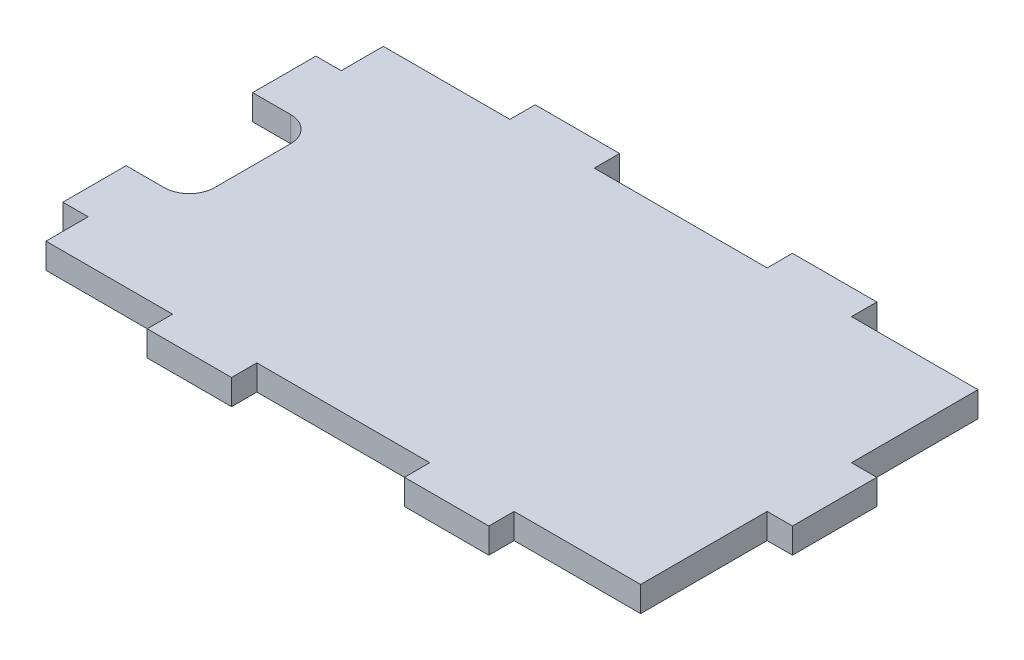
ISO-10303-21;
HEADER;
FILE_DESCRIPTION(('STEP AP214'),'2;1');
FILE_NAME('part.step','',(''),(''),'','','');
FILE_SCHEMA(('AUTOMOTIVE_DESIGN { 1 0 10303 214 1 1 1 1 }'));
ENDSEC;
DATA;
#1=APPLICATION_CONTEXT('core data for automotive mechanical design processes');
#2=APPLICATION_PROTOCOL_DEFINITION('international standard','automotive_design',2000,#1);
#3=PRODUCT_CONTEXT('',#1,'mechanical');
#4=PRODUCT('Part','Part','',(#3));
#5=PRODUCT_RELATED_PRODUCT_CATEGORY('part','',(#4));
#6=PRODUCT_DEFINITION_FORMATION('','',#4);
#7=PRODUCT_DEFINITION_CONTEXT('part definition',#1,'design');
#8=PRODUCT_DEFINITION('design','',#6,#7);
#9=PRODUCT_DEFINITION_SHAPE('','',#8);
#10=(LENGTH_UNIT() NAMED_UNIT(*) SI_UNIT(.MILLI.,.METRE.));
#11=(NAMED_UNIT(*) PLANE_ANGLE_UNIT() SI_UNIT($,.RADIAN.));
#12=(NAMED_UNIT(*) SI_UNIT($,.STERADIAN.) SOLID_ANGLE_UNIT());
#13=UNCERTAINTY_MEASURE_WITH_UNIT(LENGTH_MEASURE(1.E-05),#10,'distance_accuracy_value','');
#14=(GEOMETRIC_REPRESENTATION_CONTEXT(3) GLOBAL_UNCERTAINTY_ASSIGNED_CONTEXT((#13)) GLOBAL_UNIT_ASSIGNED_CONTEXT((#10,
#11,#12)) REPRESENTATION_CONTEXT('',''));
#15=CARTESIAN_POINT('',(0.,0.,0.));
#16=DIRECTION('',(0.,0.,1.));
#17=DIRECTION('',(1.,0.,0.));
#18=AXIS2_PLACEMENT_3D('',#15,#16,#17);
#19=CARTESIAN_POINT('',(141.,6.,0.));
#20=DIRECTION('',(-1.,0.,0.));
#21=DIRECTION('',(0.,0.,1.));
#22=AXIS2_PLACEMENT_3D('',#19,#20,#21);
#23=PLANE('',#22);
#24=DIRECTION('',(0.,-1.,0.));
#25=VECTOR('',#24,1.);
#26=CARTESIAN_POINT('',(141.,6.,50.));
#27=LINE('',#26,#25);
#28=CARTESIAN_POINT('',(141.,6.,50.));
#29=VERTEX_POINT('',#28);
#30=CARTESIAN_POINT('',(141.,0.,50.));
#31=VERTEX_POINT('',#30);
#32=EDGE_CURVE('E47',#29,#31,#27,.T.);
#33=ORIENTED_EDGE('',*,*,#32,.F.);
#34=DIRECTION('',(0.,0.,-1.));
#35=VECTOR('',#34,1.);
#36=CARTESIAN_POINT('',(141.,6.,0.));
#37=LINE('',#36,#35);
#38=CARTESIAN_POINT('',(141.,6.,80.));
#39=VERTEX_POINT('',#38);
#40=EDGE_CURVE('E480',#39,#29,#37,.T.);
#41=ORIENTED_EDGE('',*,*,#40,.F.);
#42=DIRECTION('',(0.,-1.,0.));
#43=VECTOR('',#42,1.);
#44=CARTESIAN_POINT('',(141.,6.,80.));
#45=LINE('',#44,#43);
#46=CARTESIAN_POINT('',(141.,0.,80.));
#47=VERTEX_POINT('',#46);
#48=EDGE_CURVE('E40',#39,#47,#45,.T.);
#49=ORIENTED_EDGE('',*,*,#48,.T.);
#50=DIRECTION('',(0.,0.,-1.));
#51=VECTOR('',#50,1.);
#52=CARTESIAN_POINT('',(141.,0.,0.));
#53=LINE('',#52,#51);
#54=EDGE_CURVE('E495',#47,#31,#53,.T.);
#55=ORIENTED_EDGE('',*,*,#54,.T.);
#56=EDGE_LOOP('',(#33,#41,#49,#55));
#57=FACE_BOUND('',#56,.T.);
#58=ADVANCED_FACE('F32',(#57),#23,.F.);
#59=DIRECTION('',(0.,1.,0.));
#60=VECTOR('',#59,1.);
#61=CARTESIAN_POINT('',(141.,6.,30.));
#62=LINE('',#61,#60);
#63=CARTESIAN_POINT('',(141.,0.,30.));
#64=VERTEX_POINT('',#63);
#65=CARTESIAN_POINT('',(141.,6.,30.));
#66=VERTEX_POINT('',#65);
#67=EDGE_CURVE('E55',#64,#66,#62,.T.);
#68=ORIENTED_EDGE('',*,*,#67,.F.);
#69=CARTESIAN_POINT('',(141.,0.,0.));
#70=VERTEX_POINT('',#69);
#71=EDGE_CURVE('E493',#64,#70,#53,.T.);
#72=ORIENTED_EDGE('',*,*,#71,.T.);
#73=DIRECTION('',(0.,-1.,0.));
#74=VECTOR('',#73,1.);
#75=CARTESIAN_POINT('',(141.,6.,0.));
#76=LINE('',#75,#74);
#77=CARTESIAN_POINT('',(141.,6.,0.));
#78=VERTEX_POINT('',#77);
#79=EDGE_CURVE('E503',#78,#70,#76,.T.);
#80=ORIENTED_EDGE('',*,*,#79,.F.);
#81=EDGE_CURVE('E478',#66,#78,#37,.T.);
#82=ORIENTED_EDGE('',*,*,#81,.F.);
#83=EDGE_LOOP('',(#68,#72,#80,#82));
#84=FACE_BOUND('',#83,.T.);
#85=ADVANCED_FACE('F627',(#84),#23,.F.);
#86=CARTESIAN_POINT('',(0.,6.,0.));
#87=DIRECTION('',(1.,0.,0.));
#88=DIRECTION('',(0.,0.,-1.));
#89=AXIS2_PLACEMENT_3D('',#86,#87,#88);
#90=PLANE('',#89);
#91=DIRECTION('',(0.,1.,0.));
#92=VECTOR('',#91,1.);
#93=CARTESIAN_POINT('',(0.,0.,70.));
#94=LINE('',#93,#92);
#95=CARTESIAN_POINT('',(0.,0.,70.));
#96=VERTEX_POINT('',#95);
#97=CARTESIAN_POINT('',(0.,6.,70.));
#98=VERTEX_POINT('',#97);
#99=EDGE_CURVE('E324',#96,#98,#94,.T.);
#100=ORIENTED_EDGE('',*,*,#99,.F.);
#101=DIRECTION('',(0.,0.,1.));
#102=VECTOR('',#101,1.);
#103=CARTESIAN_POINT('',(0.,0.,0.));
#104=LINE('',#103,#102);
#105=CARTESIAN_POINT('',(0.,0.,80.));
#106=VERTEX_POINT('',#105);
#107=EDGE_CURVE('E469',#96,#106,#104,.T.);
#108=ORIENTED_EDGE('',*,*,#107,.T.);
#109=DIRECTION('',(0.,-1.,0.));
#110=VECTOR('',#109,1.);
#111=CARTESIAN_POINT('',(0.,6.,80.));
#112=LINE('',#111,#110);
#113=CARTESIAN_POINT('',(0.,6.,80.));
#114=VERTEX_POINT('',#113);
#115=EDGE_CURVE('E11',#114,#106,#112,.T.);
#116=ORIENTED_EDGE('',*,*,#115,.F.);
#117=DIRECTION('',(0.,0.,1.));
#118=VECTOR('',#117,1.);
#119=CARTESIAN_POINT('',(0.,6.,0.));
#120=LINE('',#119,#118);
#121=EDGE_CURVE('E474',#98,#114,#120,.T.);
#122=ORIENTED_EDGE('',*,*,#121,.F.);
#123=EDGE_LOOP('',(#100,#108,#116,#122));
#124=FACE_BOUND('',#123,.T.);
#125=ADVANCED_FACE('F559',(#124),#90,.F.);
#126=DIRECTION('',(0.,-1.,0.));
#127=VECTOR('',#126,1.);
#128=CARTESIAN_POINT('',(0.,0.,10.));
#129=LINE('',#128,#127);
#130=CARTESIAN_POINT('',(0.,6.,10.));
#131=VERTEX_POINT('',#130);
#132=CARTESIAN_POINT('',(0.,0.,10.));
#133=VERTEX_POINT('',#132);
#134=EDGE_CURVE('E266',#131,#133,#129,.T.);
#135=ORIENTED_EDGE('',*,*,#134,.F.);
#136=CARTESIAN_POINT('',(0.,6.,0.));
#137=VERTEX_POINT('',#136);
#138=EDGE_CURVE('E470',#137,#131,#120,.T.);
#139=ORIENTED_EDGE('',*,*,#138,.F.);
#140=DIRECTION('',(0.,-1.,0.));
#141=VECTOR('',#140,1.);
#142=CARTESIAN_POINT('',(0.,6.,0.));
#143=LINE('',#142,#141);
#144=CARTESIAN_POINT('',(0.,0.,0.));
#145=VERTEX_POINT('',#144);
#146=EDGE_CURVE('E486',#137,#145,#143,.T.);
#147=ORIENTED_EDGE('',*,*,#146,.T.);
#148=EDGE_CURVE('E488',#145,#133,#104,.T.);
#149=ORIENTED_EDGE('',*,*,#148,.T.);
#150=EDGE_LOOP('',(#135,#139,#147,#149));
#151=FACE_BOUND('',#150,.T.);
#152=ADVANCED_FACE('F34',(#151),#90,.F.);
#153=CARTESIAN_POINT('',(0.,6.,0.));
#154=DIRECTION('',(0.,0.,1.));
#155=DIRECTION('',(1.,0.,0.));
#156=AXIS2_PLACEMENT_3D('',#153,#154,#155);
#157=PLANE('',#156);
#158=DIRECTION('',(0.,-1.,0.));
#159=VECTOR('',#158,1.);
#160=CARTESIAN_POINT('',(50.,0.,0.));
#161=LINE('',#160,#159);
#162=CARTESIAN_POINT('',(50.,6.,0.));
#163=VERTEX_POINT('',#162);
#164=CARTESIAN_POINT('',(50.,0.,0.));
#165=VERTEX_POINT('',#164);
#166=EDGE_CURVE('E361',#163,#165,#161,.T.);
#167=ORIENTED_EDGE('',*,*,#166,.F.);
#168=DIRECTION('',(-1.,0.,0.));
#169=VECTOR('',#168,1.);
#170=CARTESIAN_POINT('',(0.,6.,0.));
#171=LINE('',#170,#169);
#172=CARTESIAN_POINT('',(91.,6.,0.));
#173=VERTEX_POINT('',#172);
#174=EDGE_CURVE('E487',#173,#163,#171,.T.);
#175=ORIENTED_EDGE('',*,*,#174,.F.);
#176=DIRECTION('',(0.,1.,0.));
#177=VECTOR('',#176,1.);
#178=CARTESIAN_POINT('',(91.,6.,0.));
#179=LINE('',#178,#177);
#180=CARTESIAN_POINT('',(91.,0.,0.));
#181=VERTEX_POINT('',#180);
#182=EDGE_CURVE('E393',#181,#173,#179,.T.);
#183=ORIENTED_EDGE('',*,*,#182,.F.);
#184=DIRECTION('',(-1.,0.,0.));
#185=VECTOR('',#184,1.);
#186=CARTESIAN_POINT('',(0.,0.,0.));
#187=LINE('',#186,#185);
#188=EDGE_CURVE('E500',#181,#165,#187,.T.);
#189=ORIENTED_EDGE('',*,*,#188,.T.);
#190=EDGE_LOOP('',(#167,#175,#183,#189));
#191=FACE_BOUND('',#190,.T.);
#192=ADVANCED_FACE('F598',(#191),#157,.F.);
#193=DIRECTION('',(0.,1.,0.));
#194=VECTOR('',#193,1.);
#195=CARTESIAN_POINT('',(30.,6.,0.));
#196=LINE('',#195,#194);
#197=CARTESIAN_POINT('',(30.,0.,0.));
#198=VERTEX_POINT('',#197);
#199=CARTESIAN_POINT('',(30.,6.,0.));
#200=VERTEX_POINT('',#199);
#201=EDGE_CURVE('E366',#198,#200,#196,.T.);
#202=ORIENTED_EDGE('',*,*,#201,.F.);
#203=EDGE_CURVE('E497',#198,#145,#187,.T.);
#204=ORIENTED_EDGE('',*,*,#203,.T.);
#205=ORIENTED_EDGE('',*,*,#146,.F.);
#206=EDGE_CURVE('E482',#200,#137,#171,.T.);
#207=ORIENTED_EDGE('',*,*,#206,.F.);
#208=EDGE_LOOP('',(#202,#204,#205,#207));
#209=FACE_BOUND('',#208,.T.);
#210=ADVANCED_FACE('F594',(#209),#157,.F.);
#211=DIRECTION('',(0.,-1.,0.));
#212=VECTOR('',#211,1.);
#213=CARTESIAN_POINT('',(111.,0.,0.));
#214=LINE('',#213,#212);
#215=CARTESIAN_POINT('',(111.,6.,0.));
#216=VERTEX_POINT('',#215);
#217=CARTESIAN_POINT('',(111.,0.,0.));
#218=VERTEX_POINT('',#217);
#219=EDGE_CURVE('E388',#216,#218,#214,.T.);
#220=ORIENTED_EDGE('',*,*,#219,.F.);
#221=EDGE_CURVE('E483',#78,#216,#171,.T.);
#222=ORIENTED_EDGE('',*,*,#221,.F.);
#223=ORIENTED_EDGE('',*,*,#79,.T.);
#224=EDGE_CURVE('E498',#70,#218,#187,.T.);
#225=ORIENTED_EDGE('',*,*,#224,.T.);
#226=EDGE_LOOP('',(#220,#222,#223,#225));
#227=FACE_BOUND('',#226,.T.);
#228=ADVANCED_FACE('F624',(#227),#157,.F.);
#229=CARTESIAN_POINT('',(0.,6.,80.));
#230=DIRECTION('',(0.,0.,-1.));
#231=DIRECTION('',(-1.,0.,0.));
#232=AXIS2_PLACEMENT_3D('',#229,#230,#231);
#233=PLANE('',#232);
#234=DIRECTION('',(0.,-1.,0.));
#235=VECTOR('',#234,1.);
#236=CARTESIAN_POINT('',(91.,0.,80.));
#237=LINE('',#236,#235);
#238=CARTESIAN_POINT('',(91.,6.,80.));
#239=VERTEX_POINT('',#238);
#240=CARTESIAN_POINT('',(91.,0.,80.));
#241=VERTEX_POINT('',#240);
#242=EDGE_CURVE('E415',#239,#241,#237,.T.);
#243=ORIENTED_EDGE('',*,*,#242,.F.);
#244=DIRECTION('',(1.,0.,0.));
#245=VECTOR('',#244,1.);
#246=CARTESIAN_POINT('',(0.,6.,80.));
#247=LINE('',#246,#245);
#248=CARTESIAN_POINT('',(50.,6.,80.));
#249=VERTEX_POINT('',#248);
#250=EDGE_CURVE('E479',#249,#239,#247,.T.);
#251=ORIENTED_EDGE('',*,*,#250,.F.);
#252=DIRECTION('',(0.,1.,0.));
#253=VECTOR('',#252,1.);
#254=CARTESIAN_POINT('',(50.,0.,80.));
#255=LINE('',#254,#253);
#256=CARTESIAN_POINT('',(50.,0.,80.));
#257=VERTEX_POINT('',#256);
#258=EDGE_CURVE('E447',#257,#249,#255,.T.);
#259=ORIENTED_EDGE('',*,*,#258,.F.);
#260=DIRECTION('',(1.,0.,0.));
#261=VECTOR('',#260,1.);
#262=CARTESIAN_POINT('',(0.,0.,80.));
#263=LINE('',#262,#261);
#264=EDGE_CURVE('E494',#257,#241,#263,.T.);
#265=ORIENTED_EDGE('',*,*,#264,.T.);
#266=EDGE_LOOP('',(#243,#251,#259,#265));
#267=FACE_BOUND('',#266,.T.);
#268=ADVANCED_FACE('F538',(#267),#233,.F.);
#269=DIRECTION('',(0.,1.,0.));
#270=VECTOR('',#269,1.);
#271=CARTESIAN_POINT('',(111.,0.,80.));
#272=LINE('',#271,#270);
#273=CARTESIAN_POINT('',(111.,0.,80.));
#274=VERTEX_POINT('',#273);
#275=CARTESIAN_POINT('',(111.,6.,80.));
#276=VERTEX_POINT('',#275);
#277=EDGE_CURVE('E420',#274,#276,#272,.T.);
#278=ORIENTED_EDGE('',*,*,#277,.F.);
#279=EDGE_CURVE('E490',#274,#47,#263,.T.);
#280=ORIENTED_EDGE('',*,*,#279,.T.);
#281=ORIENTED_EDGE('',*,*,#48,.F.);
#282=EDGE_CURVE('E473',#276,#39,#247,.T.);
#283=ORIENTED_EDGE('',*,*,#282,.F.);
#284=EDGE_LOOP('',(#278,#280,#281,#283));
#285=FACE_BOUND('',#284,.T.);
#286=ADVANCED_FACE('F536',(#285),#233,.F.);
#287=DIRECTION('',(0.,-1.,0.));
#288=VECTOR('',#287,1.);
#289=CARTESIAN_POINT('',(30.,0.,80.));
#290=LINE('',#289,#288);
#291=CARTESIAN_POINT('',(30.,6.,80.));
#292=VERTEX_POINT('',#291);
#293=CARTESIAN_POINT('',(30.,0.,80.));
#294=VERTEX_POINT('',#293);
#295=EDGE_CURVE('E442',#292,#294,#290,.T.);
#296=ORIENTED_EDGE('',*,*,#295,.F.);
#297=EDGE_CURVE('E475',#114,#292,#247,.T.);
#298=ORIENTED_EDGE('',*,*,#297,.F.);
#299=ORIENTED_EDGE('',*,*,#115,.T.);
#300=EDGE_CURVE('E491',#106,#294,#263,.T.);
#301=ORIENTED_EDGE('',*,*,#300,.T.);
#302=EDGE_LOOP('',(#296,#298,#299,#301));
#303=FACE_BOUND('',#302,.T.);
#304=ADVANCED_FACE('F553',(#303),#233,.F.);
#305=CARTESIAN_POINT('',(0.,6.,0.));
#306=DIRECTION('',(0.,1.,0.));
#307=DIRECTION('',(0.,0.,1.));
#308=AXIS2_PLACEMENT_3D('',#305,#306,#307);
#309=PLANE('',#308);
#310=DIRECTION('',(1.,0.,0.));
#311=VECTOR('',#310,1.);
#312=CARTESIAN_POINT('',(-6.,6.,25.));
#313=LINE('',#312,#311);
#314=CARTESIAN_POINT('',(-6.,6.,25.));
#315=VERTEX_POINT('',#314);
#316=CARTESIAN_POINT('',(2.99999999999996,6.,25.));
#317=VERTEX_POINT('',#316);
#318=EDGE_CURVE('E354',#315,#317,#313,.T.);
#319=ORIENTED_EDGE('',*,*,#318,.T.);
#320=CARTESIAN_POINT('',(3.,6.,31.));
#321=DIRECTION('',(0.,1.,0.));
#322=DIRECTION('',(0.,0.,-1.));
#323=AXIS2_PLACEMENT_3D('',#320,#321,#322);
#324=CIRCLE('',#323,6.);
#325=CARTESIAN_POINT('',(9.,6.,31.));
#326=VERTEX_POINT('',#325);
#327=EDGE_CURVE('E283',#326,#317,#324,.T.);
#328=ORIENTED_EDGE('',*,*,#327,.F.);
#329=DIRECTION('',(0.,0.,-1.));
#330=VECTOR('',#329,1.);
#331=CARTESIAN_POINT('',(9.,6.,31.));
#332=LINE('',#331,#330);
#333=CARTESIAN_POINT('',(9.,6.,49.));
#334=VERTEX_POINT('',#333);
#335=EDGE_CURVE('E287',#334,#326,#332,.T.);
#336=ORIENTED_EDGE('',*,*,#335,.F.);
#337=CARTESIAN_POINT('',(3.,6.,49.));
#338=DIRECTION('',(0.,1.,0.));
#339=DIRECTION('',(0.,0.,1.));
#340=AXIS2_PLACEMENT_3D('',#337,#338,#339);
#341=CIRCLE('',#340,6.);
#342=CARTESIAN_POINT('',(2.99999999999996,6.,55.));
#343=VERTEX_POINT('',#342);
#344=EDGE_CURVE('E291',#343,#334,#341,.T.);
#345=ORIENTED_EDGE('',*,*,#344,.F.);
#346=DIRECTION('',(1.,0.,0.));
#347=VECTOR('',#346,1.);
#348=CARTESIAN_POINT('',(-6.,6.,55.));
#349=LINE('',#348,#347);
#350=CARTESIAN_POINT('',(-6.,6.,55.));
#351=VERTEX_POINT('',#350);
#352=EDGE_CURVE('E273',#351,#343,#349,.T.);
#353=ORIENTED_EDGE('',*,*,#352,.F.);
#354=DIRECTION('',(0.,0.,-1.));
#355=VECTOR('',#354,1.);
#356=CARTESIAN_POINT('',(-6.,6.,55.));
#357=LINE('',#356,#355);
#358=CARTESIAN_POINT('',(-6.,6.,70.));
#359=VERTEX_POINT('',#358);
#360=EDGE_CURVE('E330',#359,#351,#357,.T.);
#361=ORIENTED_EDGE('',*,*,#360,.F.);
#362=DIRECTION('',(1.,0.,0.));
#363=VECTOR('',#362,1.);
#364=CARTESIAN_POINT('',(-6.,6.,70.));
#365=LINE('',#364,#363);
#366=EDGE_CURVE('E335',#359,#98,#365,.T.);
#367=ORIENTED_EDGE('',*,*,#366,.T.);
#368=ORIENTED_EDGE('',*,*,#121,.T.);
#369=ORIENTED_EDGE('',*,*,#297,.T.);
#370=DIRECTION('',(0.,0.,-1.));
#371=VECTOR('',#370,1.);
#372=CARTESIAN_POINT('',(30.,6.,86.));
#373=LINE('',#372,#371);
#374=CARTESIAN_POINT('',(30.,6.,86.));
#375=VERTEX_POINT('',#374);
#376=EDGE_CURVE('E453',#375,#292,#373,.T.);
#377=ORIENTED_EDGE('',*,*,#376,.F.);
#378=DIRECTION('',(-1.,0.,0.));
#379=VECTOR('',#378,1.);
#380=CARTESIAN_POINT('',(30.,6.,86.));
#381=LINE('',#380,#379);
#382=CARTESIAN_POINT('',(50.,6.,86.));
#383=VERTEX_POINT('',#382);
#384=EDGE_CURVE('E451',#383,#375,#381,.T.);
#385=ORIENTED_EDGE('',*,*,#384,.F.);
#386=DIRECTION('',(0.,0.,-1.));
#387=VECTOR('',#386,1.);
#388=CARTESIAN_POINT('',(50.,6.,86.));
#389=LINE('',#388,#387);
#390=EDGE_CURVE('E460',#383,#249,#389,.T.);
#391=ORIENTED_EDGE('',*,*,#390,.T.);
#392=ORIENTED_EDGE('',*,*,#250,.T.);
#393=DIRECTION('',(0.,0.,-1.));
#394=VECTOR('',#393,1.);
#395=CARTESIAN_POINT('',(91.,6.,86.));
#396=LINE('',#395,#394);
#397=CARTESIAN_POINT('',(91.,6.,86.));
#398=VERTEX_POINT('',#397);
#399=EDGE_CURVE('E426',#398,#239,#396,.T.);
#400=ORIENTED_EDGE('',*,*,#399,.F.);
#401=DIRECTION('',(-1.,0.,0.));
#402=VECTOR('',#401,1.);
#403=CARTESIAN_POINT('',(91.,6.,86.));
#404=LINE('',#403,#402);
#405=CARTESIAN_POINT('',(111.,6.,86.));
#406=VERTEX_POINT('',#405);
#407=EDGE_CURVE('E424',#406,#398,#404,.T.);
#408=ORIENTED_EDGE('',*,*,#407,.F.);
#409=DIRECTION('',(0.,0.,-1.));
#410=VECTOR('',#409,1.);
#411=CARTESIAN_POINT('',(111.,6.,86.));
#412=LINE('',#411,#410);
#413=EDGE_CURVE('E433',#406,#276,#412,.T.);
#414=ORIENTED_EDGE('',*,*,#413,.T.);
#415=ORIENTED_EDGE('',*,*,#282,.T.);
#416=ORIENTED_EDGE('',*,*,#40,.T.);
#417=DIRECTION('',(-1.,0.,0.));
#418=VECTOR('',#417,1.);
#419=CARTESIAN_POINT('',(147.,6.,50.));
#420=LINE('',#419,#418);
#421=CARTESIAN_POINT('',(147.,6.,50.));
#422=VERTEX_POINT('',#421);
#423=EDGE_CURVE('E310',#422,#29,#420,.T.);
#424=ORIENTED_EDGE('',*,*,#423,.F.);
#425=DIRECTION('',(0.,0.,1.));
#426=VECTOR('',#425,1.);
#427=CARTESIAN_POINT('',(147.,6.,50.));
#428=LINE('',#427,#426);
#429=CARTESIAN_POINT('',(147.,6.,30.));
#430=VERTEX_POINT('',#429);
#431=EDGE_CURVE('E308',#430,#422,#428,.T.);
#432=ORIENTED_EDGE('',*,*,#431,.F.);
#433=DIRECTION('',(-1.,0.,0.));
#434=VECTOR('',#433,1.);
#435=CARTESIAN_POINT('',(147.,6.,30.));
#436=LINE('',#435,#434);
#437=EDGE_CURVE('E315',#430,#66,#436,.T.);
#438=ORIENTED_EDGE('',*,*,#437,.T.);
#439=ORIENTED_EDGE('',*,*,#81,.T.);
#440=ORIENTED_EDGE('',*,*,#221,.T.);
#441=DIRECTION('',(0.,0.,1.));
#442=VECTOR('',#441,1.);
#443=CARTESIAN_POINT('',(111.,6.,-6.));
#444=LINE('',#443,#442);
#445=CARTESIAN_POINT('',(111.,6.,-6.));
#446=VERTEX_POINT('',#445);
#447=EDGE_CURVE('E412',#446,#216,#444,.T.);
#448=ORIENTED_EDGE('',*,*,#447,.F.);
#449=DIRECTION('',(1.,0.,0.));
#450=VECTOR('',#449,1.);
#451=CARTESIAN_POINT('',(111.,6.,-6.));
#452=LINE('',#451,#450);
#453=CARTESIAN_POINT('',(91.,6.,-6.));
#454=VERTEX_POINT('',#453);
#455=EDGE_CURVE('E389',#454,#446,#452,.T.);
#456=ORIENTED_EDGE('',*,*,#455,.F.);
#457=DIRECTION('',(0.,0.,1.));
#458=VECTOR('',#457,1.);
#459=CARTESIAN_POINT('',(91.,6.,-6.));
#460=LINE('',#459,#458);
#461=EDGE_CURVE('E399',#454,#173,#460,.T.);
#462=ORIENTED_EDGE('',*,*,#461,.T.);
#463=ORIENTED_EDGE('',*,*,#174,.T.);
#464=DIRECTION('',(0.,0.,1.));
#465=VECTOR('',#464,1.);
#466=CARTESIAN_POINT('',(50.,6.,-6.));
#467=LINE('',#466,#465);
#468=CARTESIAN_POINT('',(50.,6.,-6.));
#469=VERTEX_POINT('',#468);
#470=EDGE_CURVE('E385',#469,#163,#467,.T.);
#471=ORIENTED_EDGE('',*,*,#470,.F.);
#472=DIRECTION('',(1.,0.,0.));
#473=VECTOR('',#472,1.);
#474=CARTESIAN_POINT('',(50.,6.,-6.));
#475=LINE('',#474,#473);
#476=CARTESIAN_POINT('',(30.,6.,-6.));
#477=VERTEX_POINT('',#476);
#478=EDGE_CURVE('E362',#477,#469,#475,.T.);
#479=ORIENTED_EDGE('',*,*,#478,.F.);
#480=DIRECTION('',(0.,0.,1.));
#481=VECTOR('',#480,1.);
#482=CARTESIAN_POINT('',(30.,6.,-6.));
#483=LINE('',#482,#481);
#484=EDGE_CURVE('E372',#477,#200,#483,.T.);
#485=ORIENTED_EDGE('',*,*,#484,.T.);
#486=ORIENTED_EDGE('',*,*,#206,.T.);
#487=ORIENTED_EDGE('',*,*,#138,.T.);
#488=DIRECTION('',(1.,0.,0.));
#489=VECTOR('',#488,1.);
#490=CARTESIAN_POINT('',(-6.,6.,10.));
#491=LINE('',#490,#489);
#492=CARTESIAN_POINT('',(-6.,6.,10.));
#493=VERTEX_POINT('',#492);
#494=EDGE_CURVE('E349',#493,#131,#491,.T.);
#495=ORIENTED_EDGE('',*,*,#494,.F.);
#496=DIRECTION('',(0.,0.,-1.));
#497=VECTOR('',#496,1.);
#498=CARTESIAN_POINT('',(-6.,6.,10.));
#499=LINE('',#498,#497);
#500=EDGE_CURVE('E347',#315,#493,#499,.T.);
#501=ORIENTED_EDGE('',*,*,#500,.F.);
#502=EDGE_LOOP('',(#319,#328,#336,#345,#353,#361,#367,#368,#369,#377,#385,#391,#392,#400,#408,
#414,#415,#416,#424,#432,#438,#439,#440,#448,#456,#462,#463,#471,#479,#485,#486,#487,#495,#501));
#503=FACE_BOUND('',#502,.T.);
#504=ADVANCED_FACE('F519',(#503),#309,.T.);
#505=CARTESIAN_POINT('',(0.,0.,0.));
#506=DIRECTION('',(0.,1.,0.));
#507=DIRECTION('',(0.,0.,1.));
#508=AXIS2_PLACEMENT_3D('',#505,#506,#507);
#509=PLANE('',#508);
#510=CARTESIAN_POINT('',(3.,0.,31.));
#511=DIRECTION('',(0.,1.,0.));
#512=DIRECTION('',(0.,0.,-1.));
#513=AXIS2_PLACEMENT_3D('',#510,#511,#512);
#514=CIRCLE('',#513,6.);
#515=CARTESIAN_POINT('',(9.,0.,31.));
#516=VERTEX_POINT('',#515);
#517=CARTESIAN_POINT('',(2.99999999999996,0.,25.));
#518=VERTEX_POINT('',#517);
#519=EDGE_CURVE('E278',#516,#518,#514,.T.);
#520=ORIENTED_EDGE('',*,*,#519,.T.);
#521=DIRECTION('',(1.,0.,0.));
#522=VECTOR('',#521,1.);
#523=CARTESIAN_POINT('',(-6.,0.,25.));
#524=LINE('',#523,#522);
#525=CARTESIAN_POINT('',(-6.,0.,25.));
#526=VERTEX_POINT('',#525);
#527=EDGE_CURVE('E356',#526,#518,#524,.T.);
#528=ORIENTED_EDGE('',*,*,#527,.F.);
#529=DIRECTION('',(0.,0.,1.));
#530=VECTOR('',#529,1.);
#531=CARTESIAN_POINT('',(-6.,0.,10.));
#532=LINE('',#531,#530);
#533=CARTESIAN_POINT('',(-6.,0.,10.));
#534=VERTEX_POINT('',#533);
#535=EDGE_CURVE('E343',#534,#526,#532,.T.);
#536=ORIENTED_EDGE('',*,*,#535,.F.);
#537=DIRECTION('',(1.,0.,0.));
#538=VECTOR('',#537,1.);
#539=CARTESIAN_POINT('',(-6.,0.,10.));
#540=LINE('',#539,#538);
#541=EDGE_CURVE('E358',#534,#133,#540,.T.);
#542=ORIENTED_EDGE('',*,*,#541,.T.);
#543=ORIENTED_EDGE('',*,*,#148,.F.);
#544=ORIENTED_EDGE('',*,*,#203,.F.);
#545=DIRECTION('',(0.,0.,1.));
#546=VECTOR('',#545,1.);
#547=CARTESIAN_POINT('',(30.,0.,-6.));
#548=LINE('',#547,#546);
#549=CARTESIAN_POINT('',(30.,0.,-6.));
#550=VERTEX_POINT('',#549);
#551=EDGE_CURVE('E379',#550,#198,#548,.T.);
#552=ORIENTED_EDGE('',*,*,#551,.F.);
#553=DIRECTION('',(-1.,0.,0.));
#554=VECTOR('',#553,1.);
#555=CARTESIAN_POINT('',(30.,0.,-6.));
#556=LINE('',#555,#554);
#557=CARTESIAN_POINT('',(50.,0.,-6.));
#558=VERTEX_POINT('',#557);
#559=EDGE_CURVE('E368',#558,#550,#556,.T.);
#560=ORIENTED_EDGE('',*,*,#559,.F.);
#561=DIRECTION('',(0.,0.,1.));
#562=VECTOR('',#561,1.);
#563=CARTESIAN_POINT('',(50.,0.,-6.));
#564=LINE('',#563,#562);
#565=EDGE_CURVE('E382',#558,#165,#564,.T.);
#566=ORIENTED_EDGE('',*,*,#565,.T.);
#567=ORIENTED_EDGE('',*,*,#188,.F.);
#568=DIRECTION('',(0.,0.,1.));
#569=VECTOR('',#568,1.);
#570=CARTESIAN_POINT('',(91.,0.,-6.));
#571=LINE('',#570,#569);
#572=CARTESIAN_POINT('',(91.,0.,-6.));
#573=VERTEX_POINT('',#572);
#574=EDGE_CURVE('E406',#573,#181,#571,.T.);
#575=ORIENTED_EDGE('',*,*,#574,.F.);
#576=DIRECTION('',(-1.,0.,0.));
#577=VECTOR('',#576,1.);
#578=CARTESIAN_POINT('',(91.,0.,-6.));
#579=LINE('',#578,#577);
#580=CARTESIAN_POINT('',(111.,0.,-6.));
#581=VERTEX_POINT('',#580);
#582=EDGE_CURVE('E395',#581,#573,#579,.T.);
#583=ORIENTED_EDGE('',*,*,#582,.F.);
#584=DIRECTION('',(0.,0.,1.));
#585=VECTOR('',#584,1.);
#586=CARTESIAN_POINT('',(111.,0.,-6.));
#587=LINE('',#586,#585);
#588=EDGE_CURVE('E409',#581,#218,#587,.T.);
#589=ORIENTED_EDGE('',*,*,#588,.T.);
#590=ORIENTED_EDGE('',*,*,#224,.F.);
#591=ORIENTED_EDGE('',*,*,#71,.F.);
#592=DIRECTION('',(-1.,0.,0.));
#593=VECTOR('',#592,1.);
#594=CARTESIAN_POINT('',(147.,0.,30.));
#595=LINE('',#594,#593);
#596=CARTESIAN_POINT('',(147.,0.,30.));
#597=VERTEX_POINT('',#596);
#598=EDGE_CURVE('E318',#597,#64,#595,.T.);
#599=ORIENTED_EDGE('',*,*,#598,.F.);
#600=DIRECTION('',(0.,0.,-1.));
#601=VECTOR('',#600,1.);
#602=CARTESIAN_POINT('',(147.,0.,50.));
#603=LINE('',#602,#601);
#604=CARTESIAN_POINT('',(147.,0.,50.));
#605=VERTEX_POINT('',#604);
#606=EDGE_CURVE('E304',#605,#597,#603,.T.);
#607=ORIENTED_EDGE('',*,*,#606,.F.);
#608=DIRECTION('',(-1.,0.,0.));
#609=VECTOR('',#608,1.);
#610=CARTESIAN_POINT('',(147.,0.,50.));
#611=LINE('',#610,#609);
#612=EDGE_CURVE('E321',#605,#31,#611,.T.);
#613=ORIENTED_EDGE('',*,*,#612,.T.);
#614=ORIENTED_EDGE('',*,*,#54,.F.);
#615=ORIENTED_EDGE('',*,*,#279,.F.);
#616=DIRECTION('',(0.,0.,-1.));
#617=VECTOR('',#616,1.);
#618=CARTESIAN_POINT('',(111.,0.,86.));
#619=LINE('',#618,#617);
#620=CARTESIAN_POINT('',(111.,0.,86.));
#621=VERTEX_POINT('',#620);
#622=EDGE_CURVE('E436',#621,#274,#619,.T.);
#623=ORIENTED_EDGE('',*,*,#622,.F.);
#624=DIRECTION('',(1.,0.,0.));
#625=VECTOR('',#624,1.);
#626=CARTESIAN_POINT('',(91.,0.,86.));
#627=LINE('',#626,#625);
#628=CARTESIAN_POINT('',(91.,0.,86.));
#629=VERTEX_POINT('',#628);
#630=EDGE_CURVE('E419',#629,#621,#627,.T.);
#631=ORIENTED_EDGE('',*,*,#630,.F.);
#632=DIRECTION('',(0.,0.,-1.));
#633=VECTOR('',#632,1.);
#634=CARTESIAN_POINT('',(91.,0.,86.));
#635=LINE('',#634,#633);
#636=EDGE_CURVE('E439',#629,#241,#635,.T.);
#637=ORIENTED_EDGE('',*,*,#636,.T.);
#638=ORIENTED_EDGE('',*,*,#264,.F.);
#639=DIRECTION('',(0.,0.,-1.));
#640=VECTOR('',#639,1.);
#641=CARTESIAN_POINT('',(50.,0.,86.));
#642=LINE('',#641,#640);
#643=CARTESIAN_POINT('',(50.,0.,86.));
#644=VERTEX_POINT('',#643);
#645=EDGE_CURVE('E463',#644,#257,#642,.T.);
#646=ORIENTED_EDGE('',*,*,#645,.F.);
#647=DIRECTION('',(1.,0.,0.));
#648=VECTOR('',#647,1.);
#649=CARTESIAN_POINT('',(30.,0.,86.));
#650=LINE('',#649,#648);
#651=CARTESIAN_POINT('',(30.,0.,86.));
#652=VERTEX_POINT('',#651);
#653=EDGE_CURVE('E446',#652,#644,#650,.T.);
#654=ORIENTED_EDGE('',*,*,#653,.F.);
#655=DIRECTION('',(0.,0.,-1.));
#656=VECTOR('',#655,1.);
#657=CARTESIAN_POINT('',(30.,0.,86.));
#658=LINE('',#657,#656);
#659=EDGE_CURVE('E466',#652,#294,#658,.T.);
#660=ORIENTED_EDGE('',*,*,#659,.T.);
#661=ORIENTED_EDGE('',*,*,#300,.F.);
#662=ORIENTED_EDGE('',*,*,#107,.F.);
#663=DIRECTION('',(1.,0.,0.));
#664=VECTOR('',#663,1.);
#665=CARTESIAN_POINT('',(-6.,0.,70.));
#666=LINE('',#665,#664);
#667=CARTESIAN_POINT('',(-6.,0.,70.));
#668=VERTEX_POINT('',#667);
#669=EDGE_CURVE('E267',#668,#96,#666,.T.);
#670=ORIENTED_EDGE('',*,*,#669,.F.);
#671=DIRECTION('',(0.,0.,1.));
#672=VECTOR('',#671,1.);
#673=CARTESIAN_POINT('',(-6.,0.,55.));
#674=LINE('',#673,#672);
#675=CARTESIAN_POINT('',(-6.,0.,55.));
#676=VERTEX_POINT('',#675);
#677=EDGE_CURVE('E262',#676,#668,#674,.T.);
#678=ORIENTED_EDGE('',*,*,#677,.F.);
#679=DIRECTION('',(1.,0.,0.));
#680=VECTOR('',#679,1.);
#681=CARTESIAN_POINT('',(-6.,0.,55.));
#682=LINE('',#681,#680);
#683=CARTESIAN_POINT('',(2.99999999999996,0.,55.));
#684=VERTEX_POINT('',#683);
#685=EDGE_CURVE('E254',#676,#684,#682,.T.);
#686=ORIENTED_EDGE('',*,*,#685,.T.);
#687=CARTESIAN_POINT('',(3.,0.,49.));
#688=DIRECTION('',(0.,1.,0.));
#689=DIRECTION('',(0.,0.,1.));
#690=AXIS2_PLACEMENT_3D('',#687,#688,#689);
#691=CIRCLE('',#690,6.);
#692=CARTESIAN_POINT('',(9.,0.,49.));
#693=VERTEX_POINT('',#692);
#694=EDGE_CURVE('E260',#684,#693,#691,.T.);
#695=ORIENTED_EDGE('',*,*,#694,.T.);
#696=DIRECTION('',(0.,0.,-1.));
#697=VECTOR('',#696,1.);
#698=CARTESIAN_POINT('',(9.,0.,31.));
#699=LINE('',#698,#697);
#700=EDGE_CURVE('E282',#693,#516,#699,.T.);
#701=ORIENTED_EDGE('',*,*,#700,.T.);
#702=EDGE_LOOP('',(#520,#528,#536,#542,#543,#544,#552,#560,#566,#567,#575,#583,#589,#590,#591,
#599,#607,#613,#614,#615,#623,#631,#637,#638,#646,#654,#660,#661,#662,#670,#678,#686,#695,#701));
#703=FACE_BOUND('',#702,.T.);
#704=ADVANCED_FACE('F257',(#703),#509,.F.);
#705=CARTESIAN_POINT('',(30.,0.,86.));
#706=DIRECTION('',(1.,0.,0.));
#707=DIRECTION('',(0.,0.,-1.));
#708=AXIS2_PLACEMENT_3D('',#705,#706,#707);
#709=PLANE('',#708);
#710=ORIENTED_EDGE('',*,*,#295,.T.);
#711=ORIENTED_EDGE('',*,*,#659,.F.);
#712=DIRECTION('',(0.,-1.,0.));
#713=VECTOR('',#712,1.);
#714=CARTESIAN_POINT('',(30.,0.,86.));
#715=LINE('',#714,#713);
#716=EDGE_CURVE('E443',#375,#652,#715,.T.);
#717=ORIENTED_EDGE('',*,*,#716,.F.);
#718=ORIENTED_EDGE('',*,*,#376,.T.);
#719=EDGE_LOOP('',(#710,#711,#717,#718));
#720=FACE_BOUND('',#719,.T.);
#721=ADVANCED_FACE('F550',(#720),#709,.F.);
#722=CARTESIAN_POINT('',(50.,0.,86.));
#723=DIRECTION('',(-1.,0.,0.));
#724=DIRECTION('',(0.,0.,1.));
#725=AXIS2_PLACEMENT_3D('',#722,#723,#724);
#726=PLANE('',#725);
#727=ORIENTED_EDGE('',*,*,#258,.T.);
#728=ORIENTED_EDGE('',*,*,#390,.F.);
#729=DIRECTION('',(0.,1.,0.));
#730=VECTOR('',#729,1.);
#731=CARTESIAN_POINT('',(50.,0.,86.));
#732=LINE('',#731,#730);
#733=EDGE_CURVE('E449',#644,#383,#732,.T.);
#734=ORIENTED_EDGE('',*,*,#733,.F.);
#735=ORIENTED_EDGE('',*,*,#645,.T.);
#736=EDGE_LOOP('',(#727,#728,#734,#735));
#737=FACE_BOUND('',#736,.T.);
#738=ADVANCED_FACE('F542',(#737),#726,.F.);
#739=CARTESIAN_POINT('',(0.,0.,86.));
#740=DIRECTION('',(0.,0.,-1.));
#741=DIRECTION('',(-1.,0.,0.));
#742=AXIS2_PLACEMENT_3D('',#739,#740,#741);
#743=PLANE('',#742);
#744=ORIENTED_EDGE('',*,*,#716,.T.);
#745=ORIENTED_EDGE('',*,*,#653,.T.);
#746=ORIENTED_EDGE('',*,*,#733,.T.);
#747=ORIENTED_EDGE('',*,*,#384,.T.);
#748=EDGE_LOOP('',(#744,#745,#746,#747));
#749=FACE_BOUND('',#748,.T.);
#750=ADVANCED_FACE('F544',(#749),#743,.F.);
#751=CARTESIAN_POINT('',(91.,0.,86.));
#752=DIRECTION('',(1.,0.,0.));
#753=DIRECTION('',(0.,0.,-1.));
#754=AXIS2_PLACEMENT_3D('',#751,#752,#753);
#755=PLANE('',#754);
#756=ORIENTED_EDGE('',*,*,#242,.T.);
#757=ORIENTED_EDGE('',*,*,#636,.F.);
#758=DIRECTION('',(0.,-1.,0.));
#759=VECTOR('',#758,1.);
#760=CARTESIAN_POINT('',(91.,0.,86.));
#761=LINE('',#760,#759);
#762=EDGE_CURVE('E416',#398,#629,#761,.T.);
#763=ORIENTED_EDGE('',*,*,#762,.F.);
#764=ORIENTED_EDGE('',*,*,#399,.T.);
#765=EDGE_LOOP('',(#756,#757,#763,#764));
#766=FACE_BOUND('',#765,.T.);
#767=ADVANCED_FACE('F529',(#766),#755,.F.);
#768=CARTESIAN_POINT('',(111.,0.,86.));
#769=DIRECTION('',(-1.,0.,0.));
#770=DIRECTION('',(0.,0.,1.));
#771=AXIS2_PLACEMENT_3D('',#768,#769,#770);
#772=PLANE('',#771);
#773=ORIENTED_EDGE('',*,*,#277,.T.);
#774=ORIENTED_EDGE('',*,*,#413,.F.);
#775=DIRECTION('',(0.,1.,0.));
#776=VECTOR('',#775,1.);
#777=CARTESIAN_POINT('',(111.,0.,86.));
#778=LINE('',#777,#776);
#779=EDGE_CURVE('E422',#621,#406,#778,.T.);
#780=ORIENTED_EDGE('',*,*,#779,.F.);
#781=ORIENTED_EDGE('',*,*,#622,.T.);
#782=EDGE_LOOP('',(#773,#774,#780,#781));
#783=FACE_BOUND('',#782,.T.);
#784=ADVANCED_FACE('F535',(#783),#772,.F.);
#785=CARTESIAN_POINT('',(0.,0.,86.));
#786=DIRECTION('',(0.,0.,-1.));
#787=DIRECTION('',(-1.,0.,0.));
#788=AXIS2_PLACEMENT_3D('',#785,#786,#787);
#789=PLANE('',#788);
#790=ORIENTED_EDGE('',*,*,#762,.T.);
#791=ORIENTED_EDGE('',*,*,#630,.T.);
#792=ORIENTED_EDGE('',*,*,#779,.T.);
#793=ORIENTED_EDGE('',*,*,#407,.T.);
#794=EDGE_LOOP('',(#790,#791,#792,#793));
#795=FACE_BOUND('',#794,.T.);
#796=ADVANCED_FACE('F532',(#795),#789,.F.);
#797=CARTESIAN_POINT('',(111.,0.,-6.));
#798=DIRECTION('',(-1.,0.,0.));
#799=DIRECTION('',(0.,0.,1.));
#800=AXIS2_PLACEMENT_3D('',#797,#798,#799);
#801=PLANE('',#800);
#802=ORIENTED_EDGE('',*,*,#219,.T.);
#803=ORIENTED_EDGE('',*,*,#588,.F.);
#804=DIRECTION('',(0.,-1.,0.));
#805=VECTOR('',#804,1.);
#806=CARTESIAN_POINT('',(111.,0.,-6.));
#807=LINE('',#806,#805);
#808=EDGE_CURVE('E392',#446,#581,#807,.T.);
#809=ORIENTED_EDGE('',*,*,#808,.F.);
#810=ORIENTED_EDGE('',*,*,#447,.T.);
#811=EDGE_LOOP('',(#802,#803,#809,#810));
#812=FACE_BOUND('',#811,.T.);
#813=ADVANCED_FACE('F621',(#812),#801,.F.);
#814=CARTESIAN_POINT('',(91.,6.,-6.));
#815=DIRECTION('',(1.,0.,0.));
#816=DIRECTION('',(0.,0.,-1.));
#817=AXIS2_PLACEMENT_3D('',#814,#815,#816);
#818=PLANE('',#817);
#819=ORIENTED_EDGE('',*,*,#182,.T.);
#820=ORIENTED_EDGE('',*,*,#461,.F.);
#821=DIRECTION('',(0.,1.,0.));
#822=VECTOR('',#821,1.);
#823=CARTESIAN_POINT('',(91.,6.,-6.));
#824=LINE('',#823,#822);
#825=EDGE_CURVE('E397',#573,#454,#824,.T.);
#826=ORIENTED_EDGE('',*,*,#825,.F.);
#827=ORIENTED_EDGE('',*,*,#574,.T.);
#828=EDGE_LOOP('',(#819,#820,#826,#827));
#829=FACE_BOUND('',#828,.T.);
#830=ADVANCED_FACE('F612',(#829),#818,.F.);
#831=CARTESIAN_POINT('',(0.,0.,-6.));
#832=DIRECTION('',(0.,0.,1.));
#833=DIRECTION('',(1.,0.,0.));
#834=AXIS2_PLACEMENT_3D('',#831,#832,#833);
#835=PLANE('',#834);
#836=ORIENTED_EDGE('',*,*,#455,.T.);
#837=ORIENTED_EDGE('',*,*,#808,.T.);
#838=ORIENTED_EDGE('',*,*,#582,.T.);
#839=ORIENTED_EDGE('',*,*,#825,.T.);
#840=EDGE_LOOP('',(#836,#837,#838,#839));
#841=FACE_BOUND('',#840,.T.);
#842=ADVANCED_FACE('F618',(#841),#835,.F.);
#843=CARTESIAN_POINT('',(50.,0.,-6.));
#844=DIRECTION('',(-1.,0.,0.));
#845=DIRECTION('',(0.,0.,1.));
#846=AXIS2_PLACEMENT_3D('',#843,#844,#845);
#847=PLANE('',#846);
#848=ORIENTED_EDGE('',*,*,#166,.T.);
#849=ORIENTED_EDGE('',*,*,#565,.F.);
#850=DIRECTION('',(0.,-1.,0.));
#851=VECTOR('',#850,1.);
#852=CARTESIAN_POINT('',(50.,0.,-6.));
#853=LINE('',#852,#851);
#854=EDGE_CURVE('E365',#469,#558,#853,.T.);
#855=ORIENTED_EDGE('',*,*,#854,.F.);
#856=ORIENTED_EDGE('',*,*,#470,.T.);
#857=EDGE_LOOP('',(#848,#849,#855,#856));
#858=FACE_BOUND('',#857,.T.);
#859=ADVANCED_FACE('F603',(#858),#847,.F.);
#860=CARTESIAN_POINT('',(30.,6.,-6.));
#861=DIRECTION('',(1.,0.,0.));
#862=DIRECTION('',(0.,0.,-1.));
#863=AXIS2_PLACEMENT_3D('',#860,#861,#862);
#864=PLANE('',#863);
#865=ORIENTED_EDGE('',*,*,#201,.T.);
#866=ORIENTED_EDGE('',*,*,#484,.F.);
#867=DIRECTION('',(0.,1.,0.));
#868=VECTOR('',#867,1.);
#869=CARTESIAN_POINT('',(30.,6.,-6.));
#870=LINE('',#869,#868);
#871=EDGE_CURVE('E370',#550,#477,#870,.T.);
#872=ORIENTED_EDGE('',*,*,#871,.F.);
#873=ORIENTED_EDGE('',*,*,#551,.T.);
#874=EDGE_LOOP('',(#865,#866,#872,#873));
#875=FACE_BOUND('',#874,.T.);
#876=ADVANCED_FACE('F820',(#875),#864,.F.);
#877=CARTESIAN_POINT('',(0.,0.,-6.));
#878=DIRECTION('',(0.,0.,1.));
#879=DIRECTION('',(1.,0.,0.));
#880=AXIS2_PLACEMENT_3D('',#877,#878,#879);
#881=PLANE('',#880);
#882=ORIENTED_EDGE('',*,*,#478,.T.);
#883=ORIENTED_EDGE('',*,*,#854,.T.);
#884=ORIENTED_EDGE('',*,*,#559,.T.);
#885=ORIENTED_EDGE('',*,*,#871,.T.);
#886=EDGE_LOOP('',(#882,#883,#884,#885));
#887=FACE_BOUND('',#886,.T.);
#888=ADVANCED_FACE('F608',(#887),#881,.F.);
#889=CARTESIAN_POINT('',(-6.,0.,10.));
#890=DIRECTION('',(0.,0.,1.));
#891=DIRECTION('',(1.,0.,0.));
#892=AXIS2_PLACEMENT_3D('',#889,#890,#891);
#893=PLANE('',#892);
#894=ORIENTED_EDGE('',*,*,#134,.T.);
#895=ORIENTED_EDGE('',*,*,#541,.F.);
#896=DIRECTION('',(0.,-1.,0.));
#897=VECTOR('',#896,1.);
#898=CARTESIAN_POINT('',(-6.,0.,10.));
#899=LINE('',#898,#897);
#900=EDGE_CURVE('E340',#493,#534,#899,.T.);
#901=ORIENTED_EDGE('',*,*,#900,.F.);
#902=ORIENTED_EDGE('',*,*,#494,.T.);
#903=EDGE_LOOP('',(#894,#895,#901,#902));
#904=FACE_BOUND('',#903,.T.);
#905=ADVANCED_FACE('F586',(#904),#893,.F.);
#906=CARTESIAN_POINT('',(-6.,0.,25.));
#907=DIRECTION('',(0.,0.,-1.));
#908=DIRECTION('',(-1.,0.,0.));
#909=AXIS2_PLACEMENT_3D('',#906,#907,#908);
#910=PLANE('',#909);
#911=ORIENTED_EDGE('',*,*,#527,.T.);
#912=DIRECTION('',(0.,1.,0.));
#913=VECTOR('',#912,1.);
#914=CARTESIAN_POINT('',(2.99999999999996,0.,25.));
#915=LINE('',#914,#913);
#916=EDGE_CURVE('E295',#518,#317,#915,.T.);
#917=ORIENTED_EDGE('',*,*,#916,.T.);
#918=ORIENTED_EDGE('',*,*,#318,.F.);
#919=DIRECTION('',(0.,1.,0.));
#920=VECTOR('',#919,1.);
#921=CARTESIAN_POINT('',(-6.,0.,25.));
#922=LINE('',#921,#920);
#923=EDGE_CURVE('E345',#526,#315,#922,.T.);
#924=ORIENTED_EDGE('',*,*,#923,.F.);
#925=EDGE_LOOP('',(#911,#917,#918,#924));
#926=FACE_BOUND('',#925,.T.);
#927=ADVANCED_FACE('F577',(#926),#910,.F.);
#928=CARTESIAN_POINT('',(-6.,0.,0.));
#929=DIRECTION('',(1.,0.,0.));
#930=DIRECTION('',(0.,0.,-1.));
#931=AXIS2_PLACEMENT_3D('',#928,#929,#930);
#932=PLANE('',#931);
#933=ORIENTED_EDGE('',*,*,#900,.T.);
#934=ORIENTED_EDGE('',*,*,#535,.T.);
#935=ORIENTED_EDGE('',*,*,#923,.T.);
#936=ORIENTED_EDGE('',*,*,#500,.T.);
#937=EDGE_LOOP('',(#933,#934,#935,#936));
#938=FACE_BOUND('',#937,.T.);
#939=ADVANCED_FACE('F580',(#938),#932,.F.);
#940=CARTESIAN_POINT('',(-6.,0.,55.));
#941=DIRECTION('',(0.,0.,1.));
#942=DIRECTION('',(1.,0.,0.));
#943=AXIS2_PLACEMENT_3D('',#940,#941,#942);
#944=PLANE('',#943);
#945=ORIENTED_EDGE('',*,*,#352,.T.);
#946=DIRECTION('',(0.,1.,0.));
#947=VECTOR('',#946,1.);
#948=CARTESIAN_POINT('',(2.99999999999996,0.,55.));
#949=LINE('',#948,#947);
#950=EDGE_CURVE('E270',#684,#343,#949,.T.);
#951=ORIENTED_EDGE('',*,*,#950,.F.);
#952=ORIENTED_EDGE('',*,*,#685,.F.);
#953=DIRECTION('',(0.,-1.,0.));
#954=VECTOR('',#953,1.);
#955=CARTESIAN_POINT('',(-6.,0.,55.));
#956=LINE('',#955,#954);
#957=EDGE_CURVE('E325',#351,#676,#956,.T.);
#958=ORIENTED_EDGE('',*,*,#957,.F.);
#959=EDGE_LOOP('',(#945,#951,#952,#958));
#960=FACE_BOUND('',#959,.T.);
#961=ADVANCED_FACE('F271',(#960),#944,.F.);
#962=CARTESIAN_POINT('',(-6.,0.,70.));
#963=DIRECTION('',(0.,0.,-1.));
#964=DIRECTION('',(-1.,0.,0.));
#965=AXIS2_PLACEMENT_3D('',#962,#963,#964);
#966=PLANE('',#965);
#967=ORIENTED_EDGE('',*,*,#99,.T.);
#968=ORIENTED_EDGE('',*,*,#366,.F.);
#969=DIRECTION('',(0.,1.,0.));
#970=VECTOR('',#969,1.);
#971=CARTESIAN_POINT('',(-6.,0.,70.));
#972=LINE('',#971,#970);
#973=EDGE_CURVE('E328',#668,#359,#972,.T.);
#974=ORIENTED_EDGE('',*,*,#973,.F.);
#975=ORIENTED_EDGE('',*,*,#669,.T.);
#976=EDGE_LOOP('',(#967,#968,#974,#975));
#977=FACE_BOUND('',#976,.T.);
#978=ADVANCED_FACE('F561',(#977),#966,.F.);
#979=CARTESIAN_POINT('',(-6.,0.,0.));
#980=DIRECTION('',(1.,0.,0.));
#981=DIRECTION('',(0.,0.,-1.));
#982=AXIS2_PLACEMENT_3D('',#979,#980,#981);
#983=PLANE('',#982);
#984=ORIENTED_EDGE('',*,*,#957,.T.);
#985=ORIENTED_EDGE('',*,*,#677,.T.);
#986=ORIENTED_EDGE('',*,*,#973,.T.);
#987=ORIENTED_EDGE('',*,*,#360,.T.);
#988=EDGE_LOOP('',(#984,#985,#986,#987));
#989=FACE_BOUND('',#988,.T.);
#990=ADVANCED_FACE('F564',(#989),#983,.F.);
#991=CARTESIAN_POINT('',(147.,6.,50.));
#992=DIRECTION('',(0.,0.,-1.));
#993=DIRECTION('',(-1.,0.,0.));
#994=AXIS2_PLACEMENT_3D('',#991,#992,#993);
#995=PLANE('',#994);
#996=ORIENTED_EDGE('',*,*,#32,.T.);
#997=ORIENTED_EDGE('',*,*,#612,.F.);
#998=DIRECTION('',(0.,-1.,0.));
#999=VECTOR('',#998,1.);
#1000=CARTESIAN_POINT('',(147.,6.,50.));
#1001=LINE('',#1000,#999);
#1002=EDGE_CURVE('E301',#422,#605,#1001,.T.);
#1003=ORIENTED_EDGE('',*,*,#1002,.F.);
#1004=ORIENTED_EDGE('',*,*,#423,.T.);
#1005=EDGE_LOOP('',(#996,#997,#1003,#1004));
#1006=FACE_BOUND('',#1005,.T.);
#1007=ADVANCED_FACE('F515',(#1006),#995,.F.);
#1008=CARTESIAN_POINT('',(147.,6.,30.));
#1009=DIRECTION('',(0.,0.,1.));
#1010=DIRECTION('',(1.,0.,0.));
#1011=AXIS2_PLACEMENT_3D('',#1008,#1009,#1010);
#1012=PLANE('',#1011);
#1013=ORIENTED_EDGE('',*,*,#67,.T.);
#1014=ORIENTED_EDGE('',*,*,#437,.F.);
#1015=DIRECTION('',(0.,1.,0.));
#1016=VECTOR('',#1015,1.);
#1017=CARTESIAN_POINT('',(147.,6.,30.));
#1018=LINE('',#1017,#1016);
#1019=EDGE_CURVE('E306',#597,#430,#1018,.T.);
#1020=ORIENTED_EDGE('',*,*,#1019,.F.);
#1021=ORIENTED_EDGE('',*,*,#598,.T.);
#1022=EDGE_LOOP('',(#1013,#1014,#1020,#1021));
#1023=FACE_BOUND('',#1022,.T.);
#1024=ADVANCED_FACE('F630',(#1023),#1012,.F.);
#1025=CARTESIAN_POINT('',(147.,0.,0.));
#1026=DIRECTION('',(1.,0.,0.));
#1027=DIRECTION('',(0.,0.,-1.));
#1028=AXIS2_PLACEMENT_3D('',#1025,#1026,#1027);
#1029=PLANE('',#1028);
#1030=ORIENTED_EDGE('',*,*,#1002,.T.);
#1031=ORIENTED_EDGE('',*,*,#606,.T.);
#1032=ORIENTED_EDGE('',*,*,#1019,.T.);
#1033=ORIENTED_EDGE('',*,*,#431,.T.);
#1034=EDGE_LOOP('',(#1030,#1031,#1032,#1033));
#1035=FACE_BOUND('',#1034,.T.);
#1036=ADVANCED_FACE('F632',(#1035),#1029,.T.);
#1037=CARTESIAN_POINT('',(3.,0.,31.));
#1038=DIRECTION('',(0.,1.,0.));
#1039=DIRECTION('',(0.,0.,1.));
#1040=AXIS2_PLACEMENT_3D('',#1037,#1038,#1039);
#1041=CYLINDRICAL_SURFACE('',#1040,6.);
#1042=ORIENTED_EDGE('',*,*,#327,.T.);
#1043=ORIENTED_EDGE('',*,*,#916,.F.);
#1044=ORIENTED_EDGE('',*,*,#519,.F.);
#1045=DIRECTION('',(0.,1.,0.));
#1046=VECTOR('',#1045,1.);
#1047=CARTESIAN_POINT('',(9.,0.,31.));
#1048=LINE('',#1047,#1046);
#1049=EDGE_CURVE('E298',#516,#326,#1048,.T.);
#1050=ORIENTED_EDGE('',*,*,#1049,.T.);
#1051=EDGE_LOOP('',(#1042,#1043,#1044,#1050));
#1052=FACE_BOUND('',#1051,.T.);
#1053=ADVANCED_FACE('F574',(#1052),#1041,.F.);
#1054=CARTESIAN_POINT('',(9.,0.,31.));
#1055=DIRECTION('',(1.,0.,0.));
#1056=DIRECTION('',(0.,0.,-1.));
#1057=AXIS2_PLACEMENT_3D('',#1054,#1055,#1056);
#1058=PLANE('',#1057);
#1059=ORIENTED_EDGE('',*,*,#335,.T.);
#1060=ORIENTED_EDGE('',*,*,#1049,.F.);
#1061=ORIENTED_EDGE('',*,*,#700,.F.);
#1062=DIRECTION('',(0.,1.,0.));
#1063=VECTOR('',#1062,1.);
#1064=CARTESIAN_POINT('',(9.,0.,49.));
#1065=LINE('',#1064,#1063);
#1066=EDGE_CURVE('E277',#693,#334,#1065,.T.);
#1067=ORIENTED_EDGE('',*,*,#1066,.T.);
#1068=EDGE_LOOP('',(#1059,#1060,#1061,#1067));
#1069=FACE_BOUND('',#1068,.T.);
#1070=ADVANCED_FACE('F568',(#1069),#1058,.F.);
#1071=CARTESIAN_POINT('',(3.,0.,49.));
#1072=DIRECTION('',(0.,1.,0.));
#1073=DIRECTION('',(0.,0.,1.));
#1074=AXIS2_PLACEMENT_3D('',#1071,#1072,#1073);
#1075=CYLINDRICAL_SURFACE('',#1074,6.);
#1076=ORIENTED_EDGE('',*,*,#344,.T.);
#1077=ORIENTED_EDGE('',*,*,#1066,.F.);
#1078=ORIENTED_EDGE('',*,*,#694,.F.);
#1079=ORIENTED_EDGE('',*,*,#950,.T.);
#1080=EDGE_LOOP('',(#1076,#1077,#1078,#1079));
#1081=FACE_BOUND('',#1080,.T.);
#1082=ADVANCED_FACE('F280',(#1081),#1075,.F.);
#1083=CLOSED_SHELL('',(#58,#85,#125,#152,#192,#210,#228,#268,#286,#304,#504,#704,#721,#738,#750,
#767,#784,#796,#813,#830,#842,#859,#876,#888,#905,#927,#939,#961,#978,#990,#1007,#1024,#1036,
#1053,#1070,#1082));
#1084=MANIFOLD_SOLID_BREP('B2',#1083);
#1085=ADVANCED_BREP_SHAPE_REPRESENTATION('',(#18,#1084),#14);
#1086=SHAPE_DEFINITION_REPRESENTATION(#9,#1085);
ENDSEC;
END-ISO-10303-21;
